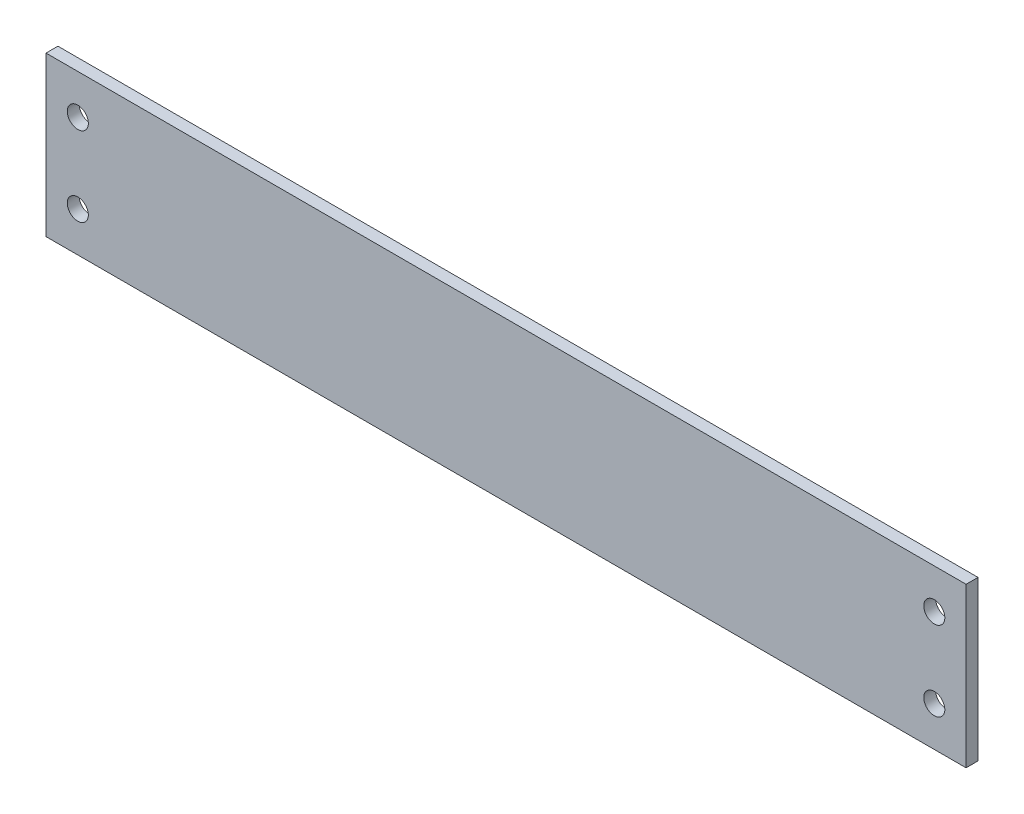
ISO-10303-21;
HEADER;
FILE_DESCRIPTION(('STEP AP214'),'2;1');
FILE_NAME('part.step','',(''),(''),'','','');
FILE_SCHEMA(('AUTOMOTIVE_DESIGN { 1 0 10303 214 1 1 1 1 }'));
ENDSEC;
DATA;
#1=APPLICATION_CONTEXT('core data for automotive mechanical design processes');
#2=APPLICATION_PROTOCOL_DEFINITION('international standard','automotive_design',2000,#1);
#3=PRODUCT_CONTEXT('',#1,'mechanical');
#4=PRODUCT('Part','Part','',(#3));
#5=PRODUCT_RELATED_PRODUCT_CATEGORY('part','',(#4));
#6=PRODUCT_DEFINITION_FORMATION('','',#4);
#7=PRODUCT_DEFINITION_CONTEXT('part definition',#1,'design');
#8=PRODUCT_DEFINITION('design','',#6,#7);
#9=PRODUCT_DEFINITION_SHAPE('','',#8);
#10=(LENGTH_UNIT() NAMED_UNIT(*) SI_UNIT(.MILLI.,.METRE.));
#11=(NAMED_UNIT(*) PLANE_ANGLE_UNIT() SI_UNIT($,.RADIAN.));
#12=(NAMED_UNIT(*) SI_UNIT($,.STERADIAN.) SOLID_ANGLE_UNIT());
#13=UNCERTAINTY_MEASURE_WITH_UNIT(LENGTH_MEASURE(1.E-05),#10,'distance_accuracy_value','');
#14=(GEOMETRIC_REPRESENTATION_CONTEXT(3) GLOBAL_UNCERTAINTY_ASSIGNED_CONTEXT((#13)) GLOBAL_UNIT_ASSIGNED_CONTEXT((#10,
#11,#12)) REPRESENTATION_CONTEXT('',''));
#15=CARTESIAN_POINT('',(0.,0.,0.));
#16=DIRECTION('',(0.,0.,1.));
#17=DIRECTION('',(1.,0.,0.));
#18=AXIS2_PLACEMENT_3D('',#15,#16,#17);
#19=CARTESIAN_POINT('',(-22.,36.75,-3.));
#20=DIRECTION('',(0.,1.,0.));
#21=DIRECTION('',(-1.,0.,0.));
#22=AXIS2_PLACEMENT_3D('',#19,#20,#21);
#23=PLANE('',#22);
#24=DIRECTION('',(-1.,0.,0.));
#25=VECTOR('',#24,1.);
#26=CARTESIAN_POINT('',(-22.,36.75,0.));
#27=LINE('',#26,#25);
#28=CARTESIAN_POINT('',(209.5,36.75,0.));
#29=VERTEX_POINT('',#28);
#30=CARTESIAN_POINT('',(-22.,36.75,0.));
#31=VERTEX_POINT('',#30);
#32=EDGE_CURVE('E103',#29,#31,#27,.T.);
#33=ORIENTED_EDGE('',*,*,#32,.F.);
#34=DIRECTION('',(0.,0.,1.));
#35=VECTOR('',#34,1.);
#36=CARTESIAN_POINT('',(209.5,36.75,-3.));
#37=LINE('',#36,#35);
#38=CARTESIAN_POINT('',(209.5,36.75,-3.));
#39=VERTEX_POINT('',#38);
#40=EDGE_CURVE('E11',#39,#29,#37,.T.);
#41=ORIENTED_EDGE('',*,*,#40,.F.);
#42=DIRECTION('',(-1.,0.,0.));
#43=VECTOR('',#42,1.);
#44=CARTESIAN_POINT('',(-22.,36.75,-3.));
#45=LINE('',#44,#43);
#46=CARTESIAN_POINT('',(-22.,36.75,-3.));
#47=VERTEX_POINT('',#46);
#48=EDGE_CURVE('E96',#39,#47,#45,.T.);
#49=ORIENTED_EDGE('',*,*,#48,.T.);
#50=DIRECTION('',(0.,0.,1.));
#51=VECTOR('',#50,1.);
#52=CARTESIAN_POINT('',(-22.,36.75,-3.));
#53=LINE('',#52,#51);
#54=EDGE_CURVE('E40',#47,#31,#53,.T.);
#55=ORIENTED_EDGE('',*,*,#54,.T.);
#56=EDGE_LOOP('',(#33,#41,#49,#55));
#57=FACE_BOUND('',#56,.T.);
#58=ADVANCED_FACE('F37',(#57),#23,.T.);
#59=CARTESIAN_POINT('',(209.5,36.75,-3.));
#60=DIRECTION('',(1.,0.,0.));
#61=DIRECTION('',(0.,0.,-1.));
#62=AXIS2_PLACEMENT_3D('',#59,#60,#61);
#63=PLANE('',#62);
#64=DIRECTION('',(0.,1.,0.));
#65=VECTOR('',#64,1.);
#66=CARTESIAN_POINT('',(209.5,36.75,0.));
#67=LINE('',#66,#65);
#68=CARTESIAN_POINT('',(209.5,-3.25,0.));
#69=VERTEX_POINT('',#68);
#70=EDGE_CURVE('E98',#69,#29,#67,.T.);
#71=ORIENTED_EDGE('',*,*,#70,.F.);
#72=DIRECTION('',(0.,0.,1.));
#73=VECTOR('',#72,1.);
#74=CARTESIAN_POINT('',(209.5,-3.25,-3.));
#75=LINE('',#74,#73);
#76=CARTESIAN_POINT('',(209.5,-3.25,-3.));
#77=VERTEX_POINT('',#76);
#78=EDGE_CURVE('E46',#77,#69,#75,.T.);
#79=ORIENTED_EDGE('',*,*,#78,.F.);
#80=DIRECTION('',(0.,1.,0.));
#81=VECTOR('',#80,1.);
#82=CARTESIAN_POINT('',(209.5,36.75,-3.));
#83=LINE('',#82,#81);
#84=EDGE_CURVE('E92',#77,#39,#83,.T.);
#85=ORIENTED_EDGE('',*,*,#84,.T.);
#86=ORIENTED_EDGE('',*,*,#40,.T.);
#87=EDGE_LOOP('',(#71,#79,#85,#86));
#88=FACE_BOUND('',#87,.T.);
#89=ADVANCED_FACE('F115',(#88),#63,.T.);
#90=CARTESIAN_POINT('',(-22.,-3.25,-3.));
#91=DIRECTION('',(0.,-1.,0.));
#92=DIRECTION('',(0.,0.,-1.));
#93=AXIS2_PLACEMENT_3D('',#90,#91,#92);
#94=PLANE('',#93);
#95=DIRECTION('',(1.,0.,0.));
#96=VECTOR('',#95,1.);
#97=CARTESIAN_POINT('',(-22.,-3.25,0.));
#98=LINE('',#97,#96);
#99=CARTESIAN_POINT('',(-22.,-3.25,0.));
#100=VERTEX_POINT('',#99);
#101=EDGE_CURVE('E87',#100,#69,#98,.T.);
#102=ORIENTED_EDGE('',*,*,#101,.F.);
#103=DIRECTION('',(0.,0.,1.));
#104=VECTOR('',#103,1.);
#105=CARTESIAN_POINT('',(-22.,-3.25,-3.));
#106=LINE('',#105,#104);
#107=CARTESIAN_POINT('',(-22.,-3.25,-3.));
#108=VERTEX_POINT('',#107);
#109=EDGE_CURVE('E82',#108,#100,#106,.T.);
#110=ORIENTED_EDGE('',*,*,#109,.F.);
#111=DIRECTION('',(1.,0.,0.));
#112=VECTOR('',#111,1.);
#113=CARTESIAN_POINT('',(-22.,-3.25,-3.));
#114=LINE('',#113,#112);
#115=EDGE_CURVE('E85',#108,#77,#114,.T.);
#116=ORIENTED_EDGE('',*,*,#115,.T.);
#117=ORIENTED_EDGE('',*,*,#78,.T.);
#118=EDGE_LOOP('',(#102,#110,#116,#117));
#119=FACE_BOUND('',#118,.T.);
#120=ADVANCED_FACE('F84',(#119),#94,.T.);
#121=CARTESIAN_POINT('',(-22.,36.75,-3.));
#122=DIRECTION('',(-1.,0.,0.));
#123=DIRECTION('',(0.,0.,1.));
#124=AXIS2_PLACEMENT_3D('',#121,#122,#123);
#125=PLANE('',#124);
#126=DIRECTION('',(0.,-1.,0.));
#127=VECTOR('',#126,1.);
#128=CARTESIAN_POINT('',(-22.,36.75,0.));
#129=LINE('',#128,#127);
#130=EDGE_CURVE('E106',#31,#100,#129,.T.);
#131=ORIENTED_EDGE('',*,*,#130,.F.);
#132=ORIENTED_EDGE('',*,*,#54,.F.);
#133=DIRECTION('',(0.,-1.,0.));
#134=VECTOR('',#133,1.);
#135=CARTESIAN_POINT('',(-22.,36.75,-3.));
#136=LINE('',#135,#134);
#137=EDGE_CURVE('E91',#47,#108,#136,.T.);
#138=ORIENTED_EDGE('',*,*,#137,.T.);
#139=ORIENTED_EDGE('',*,*,#109,.T.);
#140=EDGE_LOOP('',(#131,#132,#138,#139));
#141=FACE_BOUND('',#140,.T.);
#142=ADVANCED_FACE('F95',(#141),#125,.T.);
#143=CARTESIAN_POINT('',(0.,0.,-3.));
#144=DIRECTION('',(0.,0.,-1.));
#145=DIRECTION('',(-1.,0.,0.));
#146=AXIS2_PLACEMENT_3D('',#143,#144,#145);
#147=PLANE('',#146);
#148=CARTESIAN_POINT('',(201.5,6.75,-3.));
#149=DIRECTION('',(0.,0.,1.));
#150=DIRECTION('',(1.,0.,0.));
#151=AXIS2_PLACEMENT_3D('',#148,#149,#150);
#152=CIRCLE('',#151,2.65000000000001);
#153=CARTESIAN_POINT('',(204.15,6.75,-3.));
#154=VERTEX_POINT('',#153);
#155=EDGE_CURVE('E156',#154,#154,#152,.T.);
#156=ORIENTED_EDGE('',*,*,#155,.T.);
#157=EDGE_LOOP('',(#156));
#158=FACE_BOUND('',#157,.T.);
#159=CARTESIAN_POINT('',(201.5,26.75,-3.));
#160=DIRECTION('',(0.,0.,1.));
#161=DIRECTION('',(1.,0.,0.));
#162=AXIS2_PLACEMENT_3D('',#159,#160,#161);
#163=CIRCLE('',#162,2.65000000000001);
#164=CARTESIAN_POINT('',(204.15,26.75,-3.));
#165=VERTEX_POINT('',#164);
#166=EDGE_CURVE('E164',#165,#165,#163,.T.);
#167=ORIENTED_EDGE('',*,*,#166,.T.);
#168=EDGE_LOOP('',(#167));
#169=FACE_BOUND('',#168,.T.);
#170=CARTESIAN_POINT('',(-14.,26.75,-3.));
#171=DIRECTION('',(0.,0.,1.));
#172=DIRECTION('',(1.,0.,0.));
#173=AXIS2_PLACEMENT_3D('',#170,#171,#172);
#174=CIRCLE('',#173,2.65);
#175=CARTESIAN_POINT('',(-11.35,26.75,-3.));
#176=VERTEX_POINT('',#175);
#177=EDGE_CURVE('E170',#176,#176,#174,.T.);
#178=ORIENTED_EDGE('',*,*,#177,.T.);
#179=EDGE_LOOP('',(#178));
#180=FACE_BOUND('',#179,.T.);
#181=CARTESIAN_POINT('',(-14.,6.74999999999999,-3.));
#182=DIRECTION('',(0.,0.,1.));
#183=DIRECTION('',(1.,0.,0.));
#184=AXIS2_PLACEMENT_3D('',#181,#182,#183);
#185=CIRCLE('',#184,2.65);
#186=CARTESIAN_POINT('',(-11.35,6.74999999999999,-3.));
#187=VERTEX_POINT('',#186);
#188=EDGE_CURVE('E107',#187,#187,#185,.T.);
#189=ORIENTED_EDGE('',*,*,#188,.T.);
#190=EDGE_LOOP('',(#189));
#191=FACE_BOUND('',#190,.T.);
#192=ORIENTED_EDGE('',*,*,#48,.F.);
#193=ORIENTED_EDGE('',*,*,#84,.F.);
#194=ORIENTED_EDGE('',*,*,#115,.F.);
#195=ORIENTED_EDGE('',*,*,#137,.F.);
#196=EDGE_LOOP('',(#192,#193,#194,#195));
#197=FACE_BOUND('',#196,.T.);
#198=ADVANCED_FACE('F90',(#158,#169,#180,#191,#197),#147,.T.);
#199=CARTESIAN_POINT('',(0.,0.,0.));
#200=DIRECTION('',(0.,0.,-1.));
#201=DIRECTION('',(-1.,0.,0.));
#202=AXIS2_PLACEMENT_3D('',#199,#200,#201);
#203=PLANE('',#202);
#204=CARTESIAN_POINT('',(201.5,6.75,0.));
#205=DIRECTION('',(0.,0.,1.));
#206=DIRECTION('',(1.,0.,0.));
#207=AXIS2_PLACEMENT_3D('',#204,#205,#206);
#208=CIRCLE('',#207,2.65000000000001);
#209=CARTESIAN_POINT('',(204.15,6.75,0.));
#210=VERTEX_POINT('',#209);
#211=EDGE_CURVE('E159',#210,#210,#208,.T.);
#212=ORIENTED_EDGE('',*,*,#211,.F.);
#213=EDGE_LOOP('',(#212));
#214=FACE_BOUND('',#213,.T.);
#215=CARTESIAN_POINT('',(201.5,26.75,0.));
#216=DIRECTION('',(0.,0.,1.));
#217=DIRECTION('',(1.,0.,0.));
#218=AXIS2_PLACEMENT_3D('',#215,#216,#217);
#219=CIRCLE('',#218,2.65000000000001);
#220=CARTESIAN_POINT('',(204.15,26.75,0.));
#221=VERTEX_POINT('',#220);
#222=EDGE_CURVE('E161',#221,#221,#219,.T.);
#223=ORIENTED_EDGE('',*,*,#222,.F.);
#224=EDGE_LOOP('',(#223));
#225=FACE_BOUND('',#224,.T.);
#226=CARTESIAN_POINT('',(-14.,26.75,0.));
#227=DIRECTION('',(0.,0.,1.));
#228=DIRECTION('',(1.,0.,0.));
#229=AXIS2_PLACEMENT_3D('',#226,#227,#228);
#230=CIRCLE('',#229,2.65);
#231=CARTESIAN_POINT('',(-11.35,26.75,0.));
#232=VERTEX_POINT('',#231);
#233=EDGE_CURVE('E167',#232,#232,#230,.T.);
#234=ORIENTED_EDGE('',*,*,#233,.F.);
#235=EDGE_LOOP('',(#234));
#236=FACE_BOUND('',#235,.T.);
#237=CARTESIAN_POINT('',(-14.,6.74999999999999,0.));
#238=DIRECTION('',(0.,0.,1.));
#239=DIRECTION('',(1.,0.,0.));
#240=AXIS2_PLACEMENT_3D('',#237,#238,#239);
#241=CIRCLE('',#240,2.65);
#242=CARTESIAN_POINT('',(-11.35,6.74999999999999,0.));
#243=VERTEX_POINT('',#242);
#244=EDGE_CURVE('E173',#243,#243,#241,.T.);
#245=ORIENTED_EDGE('',*,*,#244,.F.);
#246=EDGE_LOOP('',(#245));
#247=FACE_BOUND('',#246,.T.);
#248=ORIENTED_EDGE('',*,*,#32,.T.);
#249=ORIENTED_EDGE('',*,*,#130,.T.);
#250=ORIENTED_EDGE('',*,*,#101,.T.);
#251=ORIENTED_EDGE('',*,*,#70,.T.);
#252=EDGE_LOOP('',(#248,#249,#250,#251));
#253=FACE_BOUND('',#252,.T.);
#254=ADVANCED_FACE('F114',(#214,#225,#236,#247,#253),#203,.F.);
#255=CARTESIAN_POINT('',(-14.,6.74999999999999,-3.));
#256=DIRECTION('',(0.,0.,1.));
#257=DIRECTION('',(1.,0.,0.));
#258=AXIS2_PLACEMENT_3D('',#255,#256,#257);
#259=CYLINDRICAL_SURFACE('',#258,2.65);
#260=ORIENTED_EDGE('',*,*,#188,.F.);
#261=EDGE_LOOP('',(#260));
#262=FACE_BOUND('',#261,.T.);
#263=ORIENTED_EDGE('',*,*,#244,.T.);
#264=EDGE_LOOP('',(#263));
#265=FACE_BOUND('',#264,.T.);
#266=ADVANCED_FACE('F133',(#262,#265),#259,.F.);
#267=CARTESIAN_POINT('',(-14.,26.75,-3.));
#268=DIRECTION('',(0.,0.,1.));
#269=DIRECTION('',(1.,0.,0.));
#270=AXIS2_PLACEMENT_3D('',#267,#268,#269);
#271=CYLINDRICAL_SURFACE('',#270,2.65);
#272=ORIENTED_EDGE('',*,*,#177,.F.);
#273=EDGE_LOOP('',(#272));
#274=FACE_BOUND('',#273,.T.);
#275=ORIENTED_EDGE('',*,*,#233,.T.);
#276=EDGE_LOOP('',(#275));
#277=FACE_BOUND('',#276,.T.);
#278=ADVANCED_FACE('F140',(#274,#277),#271,.F.);
#279=CARTESIAN_POINT('',(201.5,26.75,-3.));
#280=DIRECTION('',(0.,0.,1.));
#281=DIRECTION('',(1.,0.,0.));
#282=AXIS2_PLACEMENT_3D('',#279,#280,#281);
#283=CYLINDRICAL_SURFACE('',#282,2.65000000000001);
#284=ORIENTED_EDGE('',*,*,#166,.F.);
#285=EDGE_LOOP('',(#284));
#286=FACE_BOUND('',#285,.T.);
#287=ORIENTED_EDGE('',*,*,#222,.T.);
#288=EDGE_LOOP('',(#287));
#289=FACE_BOUND('',#288,.T.);
#290=ADVANCED_FACE('F144',(#286,#289),#283,.F.);
#291=CARTESIAN_POINT('',(201.5,6.75,-3.));
#292=DIRECTION('',(0.,0.,1.));
#293=DIRECTION('',(1.,0.,0.));
#294=AXIS2_PLACEMENT_3D('',#291,#292,#293);
#295=CYLINDRICAL_SURFACE('',#294,2.65000000000001);
#296=ORIENTED_EDGE('',*,*,#155,.F.);
#297=EDGE_LOOP('',(#296));
#298=FACE_BOUND('',#297,.T.);
#299=ORIENTED_EDGE('',*,*,#211,.T.);
#300=EDGE_LOOP('',(#299));
#301=FACE_BOUND('',#300,.T.);
#302=ADVANCED_FACE('F148',(#298,#301),#295,.F.);
#303=CLOSED_SHELL('',(#58,#89,#120,#142,#198,#254,#266,#278,#290,#302));
#304=MANIFOLD_SOLID_BREP('B2',#303);
#305=ADVANCED_BREP_SHAPE_REPRESENTATION('',(#18,#304),#14);
#306=SHAPE_DEFINITION_REPRESENTATION(#9,#305);
ENDSEC;
END-ISO-10303-21;
